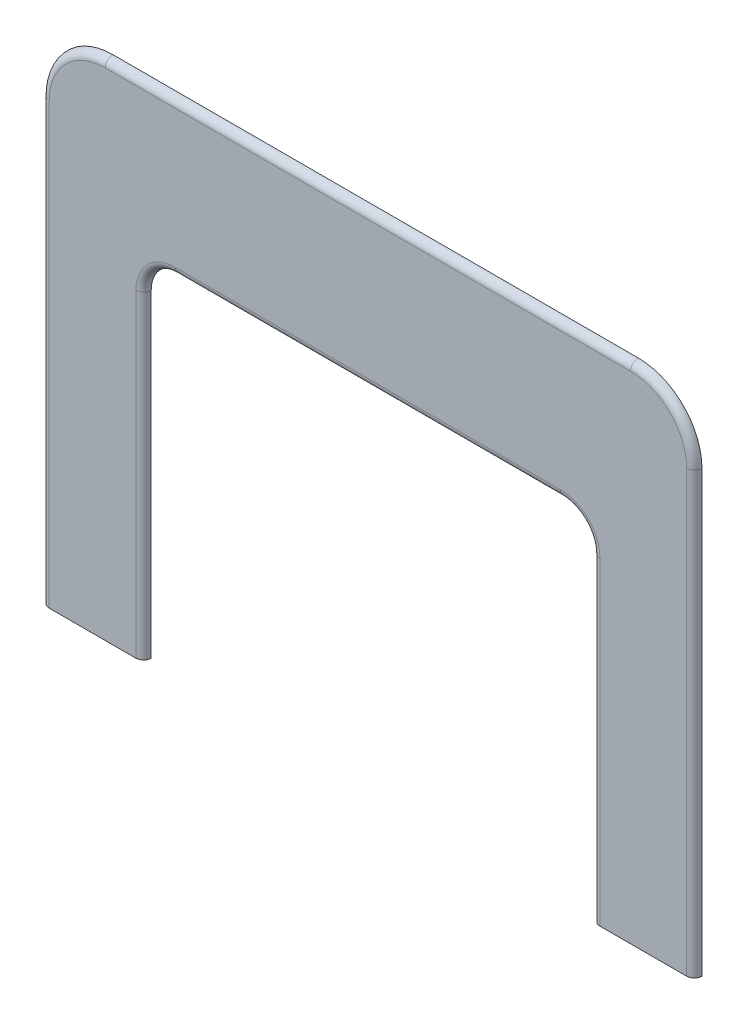
ISO-10303-21;
HEADER;
FILE_DESCRIPTION(('STEP AP214'),'2;1');
FILE_NAME('part.step','',(''),(''),'','','');
FILE_SCHEMA(('AUTOMOTIVE_DESIGN { 1 0 10303 214 1 1 1 1 }'));
ENDSEC;
DATA;
#1=APPLICATION_CONTEXT('core data for automotive mechanical design processes');
#2=APPLICATION_PROTOCOL_DEFINITION('international standard','automotive_design',2000,#1);
#3=PRODUCT_CONTEXT('',#1,'mechanical');
#4=PRODUCT('Part','Part','',(#3));
#5=PRODUCT_RELATED_PRODUCT_CATEGORY('part','',(#4));
#6=PRODUCT_DEFINITION_FORMATION('','',#4);
#7=PRODUCT_DEFINITION_CONTEXT('part definition',#1,'design');
#8=PRODUCT_DEFINITION('design','',#6,#7);
#9=PRODUCT_DEFINITION_SHAPE('','',#8);
#10=(LENGTH_UNIT() NAMED_UNIT(*) SI_UNIT(.MILLI.,.METRE.));
#11=(NAMED_UNIT(*) PLANE_ANGLE_UNIT() SI_UNIT($,.RADIAN.));
#12=(NAMED_UNIT(*) SI_UNIT($,.STERADIAN.) SOLID_ANGLE_UNIT());
#13=UNCERTAINTY_MEASURE_WITH_UNIT(LENGTH_MEASURE(1.E-05),#10,'distance_accuracy_value','');
#14=(GEOMETRIC_REPRESENTATION_CONTEXT(3) GLOBAL_UNCERTAINTY_ASSIGNED_CONTEXT((#13)) GLOBAL_UNIT_ASSIGNED_CONTEXT((#10,
#11,#12)) REPRESENTATION_CONTEXT('',''));
#15=CARTESIAN_POINT('',(0.,0.,0.));
#16=DIRECTION('',(0.,0.,1.));
#17=DIRECTION('',(1.,0.,0.));
#18=AXIS2_PLACEMENT_3D('',#15,#16,#17);
#19=CARTESIAN_POINT('',(0.,0.,1.2));
#20=DIRECTION('',(0.,1.,0.));
#21=DIRECTION('',(-1.,0.,0.));
#22=AXIS2_PLACEMENT_3D('',#19,#20,#21);
#23=PLANE('',#22);
#24=DIRECTION('',(1.,0.,0.));
#25=VECTOR('',#24,1.);
#26=CARTESIAN_POINT('',(0.,0.,1.2));
#27=LINE('',#26,#25);
#28=CARTESIAN_POINT('',(87.6,0.,1.2));
#29=VERTEX_POINT('',#28);
#30=CARTESIAN_POINT('',(101.2,0.,1.2));
#31=VERTEX_POINT('',#30);
#32=EDGE_CURVE('E137',#29,#31,#27,.T.);
#33=ORIENTED_EDGE('',*,*,#32,.F.);
#34=CARTESIAN_POINT('',(87.6,0.,0.));
#35=DIRECTION('',(0.,1.,0.));
#36=DIRECTION('',(-1.,0.,0.));
#37=AXIS2_PLACEMENT_3D('',#34,#35,#36);
#38=CIRCLE('',#37,1.2);
#39=CARTESIAN_POINT('',(86.4,0.,0.));
#40=VERTEX_POINT('',#39);
#41=EDGE_CURVE('E11',#29,#40,#38,.F.);
#42=ORIENTED_EDGE('',*,*,#41,.T.);
#43=DIRECTION('',(1.,0.,0.));
#44=VECTOR('',#43,1.);
#45=CARTESIAN_POINT('',(0.,0.,0.));
#46=LINE('',#45,#44);
#47=CARTESIAN_POINT('',(102.4,0.,0.));
#48=VERTEX_POINT('',#47);
#49=EDGE_CURVE('E135',#40,#48,#46,.T.);
#50=ORIENTED_EDGE('',*,*,#49,.T.);
#51=CARTESIAN_POINT('',(101.2,0.,0.));
#52=DIRECTION('',(0.,1.,0.));
#53=DIRECTION('',(-1.,0.,0.));
#54=AXIS2_PLACEMENT_3D('',#51,#52,#53);
#55=CIRCLE('',#54,1.2);
#56=EDGE_CURVE('E188',#48,#31,#55,.F.);
#57=ORIENTED_EDGE('',*,*,#56,.T.);
#58=EDGE_LOOP('',(#33,#42,#50,#57));
#59=FACE_BOUND('',#58,.T.);
#60=ADVANCED_FACE('F41',(#59),#23,.F.);
#61=CARTESIAN_POINT('',(0.,0.,0.));
#62=VERTEX_POINT('',#61);
#63=CARTESIAN_POINT('',(16.,0.,0.));
#64=VERTEX_POINT('',#63);
#65=EDGE_CURVE('E148',#62,#64,#46,.T.);
#66=ORIENTED_EDGE('',*,*,#65,.T.);
#67=CARTESIAN_POINT('',(14.8,0.,0.));
#68=DIRECTION('',(0.,1.,0.));
#69=DIRECTION('',(-1.,0.,0.));
#70=AXIS2_PLACEMENT_3D('',#67,#68,#69);
#71=CIRCLE('',#70,1.2);
#72=CARTESIAN_POINT('',(14.8,0.,1.2));
#73=VERTEX_POINT('',#72);
#74=EDGE_CURVE('E50',#64,#73,#71,.F.);
#75=ORIENTED_EDGE('',*,*,#74,.T.);
#76=CARTESIAN_POINT('',(1.2,0.,1.2));
#77=VERTEX_POINT('',#76);
#78=EDGE_CURVE('E171',#77,#73,#27,.T.);
#79=ORIENTED_EDGE('',*,*,#78,.F.);
#80=CARTESIAN_POINT('',(1.2,0.,0.));
#81=DIRECTION('',(0.,1.,0.));
#82=DIRECTION('',(-1.,0.,0.));
#83=AXIS2_PLACEMENT_3D('',#80,#81,#82);
#84=CIRCLE('',#83,1.2);
#85=EDGE_CURVE('E190',#77,#62,#84,.F.);
#86=ORIENTED_EDGE('',*,*,#85,.T.);
#87=EDGE_LOOP('',(#66,#75,#79,#86));
#88=FACE_BOUND('',#87,.T.);
#89=ADVANCED_FACE('F232',(#88),#23,.F.);
#90=CARTESIAN_POINT('',(0.,0.,1.2));
#91=DIRECTION('',(0.,0.,1.));
#92=DIRECTION('',(1.,0.,0.));
#93=AXIS2_PLACEMENT_3D('',#90,#91,#92);
#94=PLANE('',#93);
#95=ORIENTED_EDGE('',*,*,#78,.T.);
#96=DIRECTION('',(0.,1.,0.));
#97=VECTOR('',#96,1.);
#98=CARTESIAN_POINT('',(14.8,50.,1.2));
#99=LINE('',#98,#97);
#100=CARTESIAN_POINT('',(14.8,50.,1.2));
#101=VERTEX_POINT('',#100);
#102=EDGE_CURVE('E206',#73,#101,#99,.T.);
#103=ORIENTED_EDGE('',*,*,#102,.T.);
#104=CARTESIAN_POINT('',(21.,50.,1.2));
#105=DIRECTION('',(0.,0.,1.));
#106=DIRECTION('',(1.,0.,0.));
#107=AXIS2_PLACEMENT_3D('',#104,#105,#106);
#108=CIRCLE('',#107,6.2);
#109=CARTESIAN_POINT('',(21.,56.2,1.2));
#110=VERTEX_POINT('',#109);
#111=EDGE_CURVE('E204',#101,#110,#108,.F.);
#112=ORIENTED_EDGE('',*,*,#111,.T.);
#113=DIRECTION('',(1.,0.,0.));
#114=VECTOR('',#113,1.);
#115=CARTESIAN_POINT('',(81.4,56.2,1.2));
#116=LINE('',#115,#114);
#117=CARTESIAN_POINT('',(81.4,56.2,1.2));
#118=VERTEX_POINT('',#117);
#119=EDGE_CURVE('E192',#110,#118,#116,.T.);
#120=ORIENTED_EDGE('',*,*,#119,.T.);
#121=CARTESIAN_POINT('',(81.4,50.,1.2));
#122=DIRECTION('',(0.,0.,1.));
#123=DIRECTION('',(1.,0.,0.));
#124=AXIS2_PLACEMENT_3D('',#121,#122,#123);
#125=CIRCLE('',#124,6.2);
#126=CARTESIAN_POINT('',(87.6,50.,1.2));
#127=VERTEX_POINT('',#126);
#128=EDGE_CURVE('E66',#118,#127,#125,.F.);
#129=ORIENTED_EDGE('',*,*,#128,.T.);
#130=DIRECTION('',(0.,1.,0.));
#131=VECTOR('',#130,1.);
#132=CARTESIAN_POINT('',(87.6,0.,1.2));
#133=LINE('',#132,#131);
#134=EDGE_CURVE('E202',#127,#29,#133,.F.);
#135=ORIENTED_EDGE('',*,*,#134,.T.);
#136=ORIENTED_EDGE('',*,*,#32,.T.);
#137=DIRECTION('',(0.,1.,0.));
#138=VECTOR('',#137,1.);
#139=CARTESIAN_POINT('',(101.2,69.,1.2));
#140=LINE('',#139,#138);
#141=CARTESIAN_POINT('',(101.2,69.,1.2));
#142=VERTEX_POINT('',#141);
#143=EDGE_CURVE('E185',#31,#142,#140,.T.);
#144=ORIENTED_EDGE('',*,*,#143,.T.);
#145=CARTESIAN_POINT('',(92.4,69.,1.2));
#146=DIRECTION('',(0.,0.,1.));
#147=DIRECTION('',(1.,0.,0.));
#148=AXIS2_PLACEMENT_3D('',#145,#146,#147);
#149=CIRCLE('',#148,8.8);
#150=CARTESIAN_POINT('',(92.4,77.8,1.2));
#151=VERTEX_POINT('',#150);
#152=EDGE_CURVE('E183',#142,#151,#149,.T.);
#153=ORIENTED_EDGE('',*,*,#152,.T.);
#154=DIRECTION('',(1.,0.,0.));
#155=VECTOR('',#154,1.);
#156=CARTESIAN_POINT('',(0.,77.8,1.2));
#157=LINE('',#156,#155);
#158=CARTESIAN_POINT('',(9.99999999999996,77.8,1.2));
#159=VERTEX_POINT('',#158);
#160=EDGE_CURVE('E181',#151,#159,#157,.F.);
#161=ORIENTED_EDGE('',*,*,#160,.T.);
#162=CARTESIAN_POINT('',(9.99999999999997,69.,1.2));
#163=DIRECTION('',(0.,0.,1.));
#164=DIRECTION('',(1.,0.,0.));
#165=AXIS2_PLACEMENT_3D('',#162,#163,#164);
#166=CIRCLE('',#165,8.8);
#167=CARTESIAN_POINT('',(1.19999999999997,69.,1.2));
#168=VERTEX_POINT('',#167);
#169=EDGE_CURVE('E179',#159,#168,#166,.T.);
#170=ORIENTED_EDGE('',*,*,#169,.T.);
#171=DIRECTION('',(0.,1.,0.));
#172=VECTOR('',#171,1.);
#173=CARTESIAN_POINT('',(1.2,0.,1.2));
#174=LINE('',#173,#172);
#175=EDGE_CURVE('E177',#168,#77,#174,.F.);
#176=ORIENTED_EDGE('',*,*,#175,.T.);
#177=EDGE_LOOP('',(#95,#103,#112,#120,#129,#135,#136,#144,#153,#161,#170,#176));
#178=FACE_BOUND('',#177,.T.);
#179=ADVANCED_FACE('F227',(#178),#94,.T.);
#180=CARTESIAN_POINT('',(0.,0.,0.));
#181=DIRECTION('',(0.,0.,1.));
#182=DIRECTION('',(1.,0.,0.));
#183=AXIS2_PLACEMENT_3D('',#180,#181,#182);
#184=PLANE('',#183);
#185=DIRECTION('',(1.,0.,0.));
#186=VECTOR('',#185,1.);
#187=CARTESIAN_POINT('',(0.,79.,0.));
#188=LINE('',#187,#186);
#189=CARTESIAN_POINT('',(9.99999999999996,79.,0.));
#190=VERTEX_POINT('',#189);
#191=CARTESIAN_POINT('',(92.4,79.,0.));
#192=VERTEX_POINT('',#191);
#193=EDGE_CURVE('E159',#190,#192,#188,.T.);
#194=ORIENTED_EDGE('',*,*,#193,.T.);
#195=CARTESIAN_POINT('',(92.4,69.,0.));
#196=DIRECTION('',(0.,0.,1.));
#197=DIRECTION('',(1.,0.,0.));
#198=AXIS2_PLACEMENT_3D('',#195,#196,#197);
#199=CIRCLE('',#198,10.);
#200=CARTESIAN_POINT('',(102.4,69.,0.));
#201=VERTEX_POINT('',#200);
#202=EDGE_CURVE('E170',#192,#201,#199,.F.);
#203=ORIENTED_EDGE('',*,*,#202,.T.);
#204=DIRECTION('',(0.,1.,0.));
#205=VECTOR('',#204,1.);
#206=CARTESIAN_POINT('',(102.4,0.,0.));
#207=LINE('',#206,#205);
#208=EDGE_CURVE('E145',#48,#201,#207,.T.);
#209=ORIENTED_EDGE('',*,*,#208,.F.);
#210=ORIENTED_EDGE('',*,*,#49,.F.);
#211=DIRECTION('',(0.,1.,0.));
#212=VECTOR('',#211,1.);
#213=CARTESIAN_POINT('',(86.4,0.,0.));
#214=LINE('',#213,#212);
#215=CARTESIAN_POINT('',(86.4,50.,0.));
#216=VERTEX_POINT('',#215);
#217=EDGE_CURVE('E142',#40,#216,#214,.T.);
#218=ORIENTED_EDGE('',*,*,#217,.T.);
#219=CARTESIAN_POINT('',(81.4,50.,0.));
#220=DIRECTION('',(0.,0.,1.));
#221=DIRECTION('',(1.,0.,0.));
#222=AXIS2_PLACEMENT_3D('',#219,#220,#221);
#223=CIRCLE('',#222,5.);
#224=CARTESIAN_POINT('',(81.4,55.,0.));
#225=VERTEX_POINT('',#224);
#226=EDGE_CURVE('E173',#216,#225,#223,.T.);
#227=ORIENTED_EDGE('',*,*,#226,.T.);
#228=DIRECTION('',(1.,0.,0.));
#229=VECTOR('',#228,1.);
#230=CARTESIAN_POINT('',(0.,55.,0.));
#231=LINE('',#230,#229);
#232=CARTESIAN_POINT('',(21.,55.,0.));
#233=VERTEX_POINT('',#232);
#234=EDGE_CURVE('E165',#233,#225,#231,.T.);
#235=ORIENTED_EDGE('',*,*,#234,.F.);
#236=CARTESIAN_POINT('',(21.,50.,0.));
#237=DIRECTION('',(0.,0.,1.));
#238=DIRECTION('',(1.,0.,0.));
#239=AXIS2_PLACEMENT_3D('',#236,#237,#238);
#240=CIRCLE('',#239,5.);
#241=CARTESIAN_POINT('',(16.,50.,0.));
#242=VERTEX_POINT('',#241);
#243=EDGE_CURVE('E175',#233,#242,#240,.T.);
#244=ORIENTED_EDGE('',*,*,#243,.T.);
#245=DIRECTION('',(0.,1.,0.));
#246=VECTOR('',#245,1.);
#247=CARTESIAN_POINT('',(16.,0.,0.));
#248=LINE('',#247,#246);
#249=EDGE_CURVE('E163',#64,#242,#248,.T.);
#250=ORIENTED_EDGE('',*,*,#249,.F.);
#251=ORIENTED_EDGE('',*,*,#65,.F.);
#252=DIRECTION('',(0.,1.,0.));
#253=VECTOR('',#252,1.);
#254=CARTESIAN_POINT('',(0.,0.,0.));
#255=LINE('',#254,#253);
#256=CARTESIAN_POINT('',(0.,69.,0.));
#257=VERTEX_POINT('',#256);
#258=EDGE_CURVE('E161',#62,#257,#255,.T.);
#259=ORIENTED_EDGE('',*,*,#258,.T.);
#260=CARTESIAN_POINT('',(9.99999999999997,69.,0.));
#261=DIRECTION('',(0.,0.,1.));
#262=DIRECTION('',(1.,0.,0.));
#263=AXIS2_PLACEMENT_3D('',#260,#261,#262);
#264=CIRCLE('',#263,10.);
#265=EDGE_CURVE('E168',#257,#190,#264,.F.);
#266=ORIENTED_EDGE('',*,*,#265,.T.);
#267=EDGE_LOOP('',(#194,#203,#209,#210,#218,#227,#235,#244,#250,#251,#259,#266));
#268=FACE_BOUND('',#267,.T.);
#269=ADVANCED_FACE('F141',(#268),#184,.F.);
#270=CARTESIAN_POINT('',(1.2,0.,0.));
#271=DIRECTION('',(0.,1.,0.));
#272=DIRECTION('',(-1.,0.,0.));
#273=AXIS2_PLACEMENT_3D('',#270,#271,#272);
#274=CYLINDRICAL_SURFACE('',#273,1.2);
#275=ORIENTED_EDGE('',*,*,#85,.F.);
#276=ORIENTED_EDGE('',*,*,#175,.F.);
#277=CARTESIAN_POINT('',(1.19999999999997,69.,0.));
#278=DIRECTION('',(0.,1.,0.));
#279=DIRECTION('',(0.,0.,1.));
#280=AXIS2_PLACEMENT_3D('',#277,#278,#279);
#281=CIRCLE('',#280,1.2);
#282=EDGE_CURVE('E151',#257,#168,#281,.T.);
#283=ORIENTED_EDGE('',*,*,#282,.F.);
#284=ORIENTED_EDGE('',*,*,#258,.F.);
#285=EDGE_LOOP('',(#275,#276,#283,#284));
#286=FACE_BOUND('',#285,.T.);
#287=ADVANCED_FACE('F238',(#286),#274,.T.);
#288=CARTESIAN_POINT('',(9.99999999999997,69.,0.));
#289=DIRECTION('',(0.,0.,1.));
#290=DIRECTION('',(1.,0.,0.));
#291=AXIS2_PLACEMENT_3D('',#288,#289,#290);
#292=TOROIDAL_SURFACE('',#291,8.8,1.2);
#293=ORIENTED_EDGE('',*,*,#282,.T.);
#294=ORIENTED_EDGE('',*,*,#169,.F.);
#295=CARTESIAN_POINT('',(9.99999999999996,77.8,0.));
#296=DIRECTION('',(1.,0.,0.));
#297=DIRECTION('',(0.,0.,-1.));
#298=AXIS2_PLACEMENT_3D('',#295,#296,#297);
#299=CIRCLE('',#298,1.2);
#300=EDGE_CURVE('E154',#190,#159,#299,.T.);
#301=ORIENTED_EDGE('',*,*,#300,.F.);
#302=ORIENTED_EDGE('',*,*,#265,.F.);
#303=EDGE_LOOP('',(#293,#294,#301,#302));
#304=FACE_BOUND('',#303,.T.);
#305=ADVANCED_FACE('F244',(#304),#292,.T.);
#306=CARTESIAN_POINT('',(0.,77.8,0.));
#307=DIRECTION('',(1.,0.,0.));
#308=DIRECTION('',(0.,1.,0.));
#309=AXIS2_PLACEMENT_3D('',#306,#307,#308);
#310=CYLINDRICAL_SURFACE('',#309,1.2);
#311=ORIENTED_EDGE('',*,*,#300,.T.);
#312=ORIENTED_EDGE('',*,*,#160,.F.);
#313=CARTESIAN_POINT('',(92.4,77.8,0.));
#314=DIRECTION('',(1.,0.,0.));
#315=DIRECTION('',(0.,0.,-1.));
#316=AXIS2_PLACEMENT_3D('',#313,#314,#315);
#317=CIRCLE('',#316,1.2);
#318=EDGE_CURVE('E195',#192,#151,#317,.T.);
#319=ORIENTED_EDGE('',*,*,#318,.F.);
#320=ORIENTED_EDGE('',*,*,#193,.F.);
#321=EDGE_LOOP('',(#311,#312,#319,#320));
#322=FACE_BOUND('',#321,.T.);
#323=ADVANCED_FACE('F250',(#322),#310,.T.);
#324=CARTESIAN_POINT('',(92.4,69.,0.));
#325=DIRECTION('',(0.,0.,1.));
#326=DIRECTION('',(1.,0.,0.));
#327=AXIS2_PLACEMENT_3D('',#324,#325,#326);
#328=TOROIDAL_SURFACE('',#327,8.8,1.2);
#329=ORIENTED_EDGE('',*,*,#318,.T.);
#330=ORIENTED_EDGE('',*,*,#152,.F.);
#331=CARTESIAN_POINT('',(101.2,69.,0.));
#332=DIRECTION('',(0.,-1.,0.));
#333=DIRECTION('',(0.,0.,-1.));
#334=AXIS2_PLACEMENT_3D('',#331,#332,#333);
#335=CIRCLE('',#334,1.2);
#336=EDGE_CURVE('E193',#201,#142,#335,.T.);
#337=ORIENTED_EDGE('',*,*,#336,.F.);
#338=ORIENTED_EDGE('',*,*,#202,.F.);
#339=EDGE_LOOP('',(#329,#330,#337,#338));
#340=FACE_BOUND('',#339,.T.);
#341=ADVANCED_FACE('F254',(#340),#328,.T.);
#342=CARTESIAN_POINT('',(101.2,0.,0.));
#343=DIRECTION('',(0.,-1.,0.));
#344=DIRECTION('',(1.,0.,0.));
#345=AXIS2_PLACEMENT_3D('',#342,#343,#344);
#346=CYLINDRICAL_SURFACE('',#345,1.2);
#347=ORIENTED_EDGE('',*,*,#56,.F.);
#348=ORIENTED_EDGE('',*,*,#208,.T.);
#349=ORIENTED_EDGE('',*,*,#336,.T.);
#350=ORIENTED_EDGE('',*,*,#143,.F.);
#351=EDGE_LOOP('',(#347,#348,#349,#350));
#352=FACE_BOUND('',#351,.T.);
#353=ADVANCED_FACE('F257',(#352),#346,.T.);
#354=CARTESIAN_POINT('',(87.6,0.,0.));
#355=DIRECTION('',(0.,1.,0.));
#356=DIRECTION('',(-1.,0.,0.));
#357=AXIS2_PLACEMENT_3D('',#354,#355,#356);
#358=CYLINDRICAL_SURFACE('',#357,1.2);
#359=ORIENTED_EDGE('',*,*,#41,.F.);
#360=ORIENTED_EDGE('',*,*,#134,.F.);
#361=CARTESIAN_POINT('',(87.6,50.,0.));
#362=DIRECTION('',(0.,1.,0.));
#363=DIRECTION('',(0.,0.,1.));
#364=AXIS2_PLACEMENT_3D('',#361,#362,#363);
#365=CIRCLE('',#364,1.2);
#366=EDGE_CURVE('E45',#216,#127,#365,.T.);
#367=ORIENTED_EDGE('',*,*,#366,.F.);
#368=ORIENTED_EDGE('',*,*,#217,.F.);
#369=EDGE_LOOP('',(#359,#360,#367,#368));
#370=FACE_BOUND('',#369,.T.);
#371=ADVANCED_FACE('F43',(#370),#358,.T.);
#372=CARTESIAN_POINT('',(81.4,50.,0.));
#373=DIRECTION('',(0.,0.,1.));
#374=DIRECTION('',(1.,0.,0.));
#375=AXIS2_PLACEMENT_3D('',#372,#373,#374);
#376=TOROIDAL_SURFACE('',#375,6.2,1.2);
#377=ORIENTED_EDGE('',*,*,#366,.T.);
#378=ORIENTED_EDGE('',*,*,#128,.F.);
#379=CARTESIAN_POINT('',(81.4,56.2,0.));
#380=DIRECTION('',(-1.,0.,0.));
#381=DIRECTION('',(0.,0.,1.));
#382=AXIS2_PLACEMENT_3D('',#379,#380,#381);
#383=CIRCLE('',#382,1.2);
#384=EDGE_CURVE('E213',#225,#118,#383,.T.);
#385=ORIENTED_EDGE('',*,*,#384,.F.);
#386=ORIENTED_EDGE('',*,*,#226,.F.);
#387=EDGE_LOOP('',(#377,#378,#385,#386));
#388=FACE_BOUND('',#387,.T.);
#389=ADVANCED_FACE('F219',(#388),#376,.T.);
#390=CARTESIAN_POINT('',(0.,56.2,0.));
#391=DIRECTION('',(-1.,0.,0.));
#392=DIRECTION('',(0.,-1.,0.));
#393=AXIS2_PLACEMENT_3D('',#390,#391,#392);
#394=CYLINDRICAL_SURFACE('',#393,1.2);
#395=ORIENTED_EDGE('',*,*,#384,.T.);
#396=ORIENTED_EDGE('',*,*,#119,.F.);
#397=CARTESIAN_POINT('',(21.,56.2,0.));
#398=DIRECTION('',(-1.,0.,0.));
#399=DIRECTION('',(0.,0.,1.));
#400=AXIS2_PLACEMENT_3D('',#397,#398,#399);
#401=CIRCLE('',#400,1.2);
#402=EDGE_CURVE('E211',#233,#110,#401,.T.);
#403=ORIENTED_EDGE('',*,*,#402,.F.);
#404=ORIENTED_EDGE('',*,*,#234,.T.);
#405=EDGE_LOOP('',(#395,#396,#403,#404));
#406=FACE_BOUND('',#405,.T.);
#407=ADVANCED_FACE('F223',(#406),#394,.T.);
#408=CARTESIAN_POINT('',(21.,50.,0.));
#409=DIRECTION('',(0.,0.,1.));
#410=DIRECTION('',(1.,0.,0.));
#411=AXIS2_PLACEMENT_3D('',#408,#409,#410);
#412=TOROIDAL_SURFACE('',#411,6.2,1.2);
#413=ORIENTED_EDGE('',*,*,#402,.T.);
#414=ORIENTED_EDGE('',*,*,#111,.F.);
#415=CARTESIAN_POINT('',(14.8,50.,0.));
#416=DIRECTION('',(0.,-1.,0.));
#417=DIRECTION('',(0.,0.,-1.));
#418=AXIS2_PLACEMENT_3D('',#415,#416,#417);
#419=CIRCLE('',#418,1.2);
#420=EDGE_CURVE('E58',#242,#101,#419,.T.);
#421=ORIENTED_EDGE('',*,*,#420,.F.);
#422=ORIENTED_EDGE('',*,*,#243,.F.);
#423=EDGE_LOOP('',(#413,#414,#421,#422));
#424=FACE_BOUND('',#423,.T.);
#425=ADVANCED_FACE('F225',(#424),#412,.T.);
#426=CARTESIAN_POINT('',(14.8,0.,0.));
#427=DIRECTION('',(0.,-1.,0.));
#428=DIRECTION('',(1.,0.,0.));
#429=AXIS2_PLACEMENT_3D('',#426,#427,#428);
#430=CYLINDRICAL_SURFACE('',#429,1.2);
#431=ORIENTED_EDGE('',*,*,#74,.F.);
#432=ORIENTED_EDGE('',*,*,#249,.T.);
#433=ORIENTED_EDGE('',*,*,#420,.T.);
#434=ORIENTED_EDGE('',*,*,#102,.F.);
#435=EDGE_LOOP('',(#431,#432,#433,#434));
#436=FACE_BOUND('',#435,.T.);
#437=ADVANCED_FACE('F230',(#436),#430,.T.);
#438=CLOSED_SHELL('',(#60,#89,#179,#269,#287,#305,#323,#341,#353,#371,#389,#407,#425,#437));
#439=MANIFOLD_SOLID_BREP('B2',#438);
#440=ADVANCED_BREP_SHAPE_REPRESENTATION('',(#18,#439),#14);
#441=SHAPE_DEFINITION_REPRESENTATION(#9,#440);
ENDSEC;
END-ISO-10303-21;
